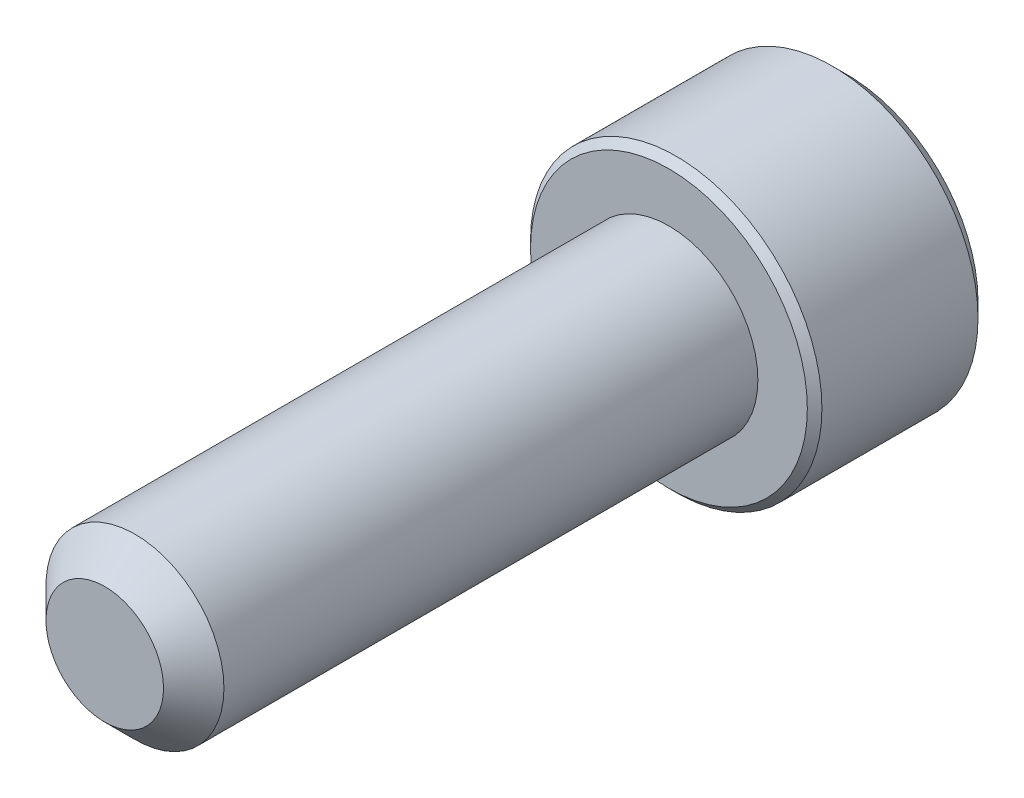
ISO-10303-21;
HEADER;
FILE_DESCRIPTION(('STEP AP214'),'2;1');
FILE_NAME('part.step','',(''),(''),'','','');
FILE_SCHEMA(('AUTOMOTIVE_DESIGN { 1 0 10303 214 1 1 1 1 }'));
ENDSEC;
DATA;
#1=APPLICATION_CONTEXT('core data for automotive mechanical design processes');
#2=APPLICATION_PROTOCOL_DEFINITION('international standard','automotive_design',2000,#1);
#3=PRODUCT_CONTEXT('',#1,'mechanical');
#4=PRODUCT('Part','Part','',(#3));
#5=PRODUCT_RELATED_PRODUCT_CATEGORY('part','',(#4));
#6=PRODUCT_DEFINITION_FORMATION('','',#4);
#7=PRODUCT_DEFINITION_CONTEXT('part definition',#1,'design');
#8=PRODUCT_DEFINITION('design','',#6,#7);
#9=PRODUCT_DEFINITION_SHAPE('','',#8);
#10=(LENGTH_UNIT() NAMED_UNIT(*) SI_UNIT(.MILLI.,.METRE.));
#11=(NAMED_UNIT(*) PLANE_ANGLE_UNIT() SI_UNIT($,.RADIAN.));
#12=(NAMED_UNIT(*) SI_UNIT($,.STERADIAN.) SOLID_ANGLE_UNIT());
#13=UNCERTAINTY_MEASURE_WITH_UNIT(LENGTH_MEASURE(1.E-05),#10,'distance_accuracy_value','');
#14=(GEOMETRIC_REPRESENTATION_CONTEXT(3) GLOBAL_UNCERTAINTY_ASSIGNED_CONTEXT((#13)) GLOBAL_UNIT_ASSIGNED_CONTEXT((#10,
#11,#12)) REPRESENTATION_CONTEXT('',''));
#15=CARTESIAN_POINT('',(0.,0.,0.));
#16=DIRECTION('',(0.,0.,1.));
#17=DIRECTION('',(1.,0.,0.));
#18=AXIS2_PLACEMENT_3D('',#15,#16,#17);
#19=CARTESIAN_POINT('',(0.,0.,-11.1125));
#20=DIRECTION('',(0.,0.,1.));
#21=DIRECTION('',(1.,0.,0.));
#22=AXIS2_PLACEMENT_3D('',#19,#20,#21);
#23=CYLINDRICAL_SURFACE('',#22,1.7526);
#24=CARTESIAN_POINT('',(0.,0.,-0.595312500000002));
#25=DIRECTION('',(0.,0.,1.));
#26=DIRECTION('',(1.,0.,0.));
#27=AXIS2_PLACEMENT_3D('',#24,#25,#26);
#28=CIRCLE('',#27,1.7526);
#29=CARTESIAN_POINT('',(1.7526,0.,-0.595312500000002));
#30=VERTEX_POINT('',#29);
#31=EDGE_CURVE('E123',#30,#30,#28,.F.);
#32=ORIENTED_EDGE('',*,*,#31,.T.);
#33=EDGE_LOOP('',(#32));
#34=FACE_BOUND('',#33,.T.);
#35=CARTESIAN_POINT('',(0.,0.,-11.1125));
#36=DIRECTION('',(0.,0.,-1.));
#37=DIRECTION('',(-1.,0.,0.));
#38=AXIS2_PLACEMENT_3D('',#35,#36,#37);
#39=CIRCLE('',#38,1.7526);
#40=CARTESIAN_POINT('',(-1.7526,0.,-11.1125));
#41=VERTEX_POINT('',#40);
#42=EDGE_CURVE('E226',#41,#41,#39,.F.);
#43=ORIENTED_EDGE('',*,*,#42,.T.);
#44=EDGE_LOOP('',(#43));
#45=FACE_BOUND('',#44,.T.);
#46=ADVANCED_FACE('F49',(#34,#45),#23,.T.);
#47=CARTESIAN_POINT('',(0.,0.,0.));
#48=DIRECTION('',(0.,0.,1.));
#49=DIRECTION('',(1.,0.,0.));
#50=AXIS2_PLACEMENT_3D('',#47,#48,#49);
#51=PLANE('',#50);
#52=CARTESIAN_POINT('',(0.,0.,0.));
#53=DIRECTION('',(0.,0.,1.));
#54=DIRECTION('',(1.,0.,0.));
#55=AXIS2_PLACEMENT_3D('',#52,#53,#54);
#56=CIRCLE('',#55,1.1572875);
#57=CARTESIAN_POINT('',(1.1572875,0.,0.));
#58=VERTEX_POINT('',#57);
#59=EDGE_CURVE('E225',#58,#58,#56,.T.);
#60=ORIENTED_EDGE('',*,*,#59,.T.);
#61=EDGE_LOOP('',(#60));
#62=FACE_BOUND('',#61,.T.);
#63=ADVANCED_FACE('F203',(#62),#51,.T.);
#64=CARTESIAN_POINT('',(0.,0.,0.));
#65=DIRECTION('',(0.,0.,-1.));
#66=DIRECTION('',(-1.,0.,0.));
#67=AXIS2_PLACEMENT_3D('',#64,#65,#66);
#68=CONICAL_SURFACE('',#67,1.1572875,0.785398163397447);
#69=ORIENTED_EDGE('',*,*,#31,.F.);
#70=EDGE_LOOP('',(#69));
#71=FACE_BOUND('',#70,.T.);
#72=ORIENTED_EDGE('',*,*,#59,.F.);
#73=EDGE_LOOP('',(#72));
#74=FACE_BOUND('',#73,.T.);
#75=ADVANCED_FACE('F209',(#71,#74),#68,.T.);
#76=CARTESIAN_POINT('',(0.,0.,-14.6177));
#77=DIRECTION('',(0.,0.,1.));
#78=DIRECTION('',(1.,0.,0.));
#79=AXIS2_PLACEMENT_3D('',#76,#77,#78);
#80=CYLINDRICAL_SURFACE('',#79,2.8702);
#81=CARTESIAN_POINT('',(0.,0.,-11.25601));
#82=DIRECTION('',(0.,0.,-1.));
#83=DIRECTION('',(-1.,0.,0.));
#84=AXIS2_PLACEMENT_3D('',#81,#82,#83);
#85=CIRCLE('',#84,2.8702);
#86=CARTESIAN_POINT('',(-2.8702,0.,-11.25601));
#87=VERTEX_POINT('',#86);
#88=EDGE_CURVE('E57',#87,#87,#85,.T.);
#89=ORIENTED_EDGE('',*,*,#88,.T.);
#90=EDGE_LOOP('',(#89));
#91=FACE_BOUND('',#90,.T.);
#92=CARTESIAN_POINT('',(0.,0.,-14.33068));
#93=DIRECTION('',(0.,0.,-1.));
#94=DIRECTION('',(-1.,0.,0.));
#95=AXIS2_PLACEMENT_3D('',#92,#93,#94);
#96=CIRCLE('',#95,2.8702);
#97=CARTESIAN_POINT('',(-2.8702,0.,-14.33068));
#98=VERTEX_POINT('',#97);
#99=EDGE_CURVE('E186',#98,#98,#96,.F.);
#100=ORIENTED_EDGE('',*,*,#99,.T.);
#101=EDGE_LOOP('',(#100));
#102=FACE_BOUND('',#101,.T.);
#103=ADVANCED_FACE('F191',(#91,#102),#80,.T.);
#104=CARTESIAN_POINT('',(0.,0.,-14.6177));
#105=DIRECTION('',(0.,0.,-1.));
#106=DIRECTION('',(-1.,0.,0.));
#107=AXIS2_PLACEMENT_3D('',#104,#105,#106);
#108=PLANE('',#107);
#109=CARTESIAN_POINT('',(0.,0.,-14.6177));
#110=DIRECTION('',(0.,0.,-1.));
#111=DIRECTION('',(-1.,0.,0.));
#112=AXIS2_PLACEMENT_3D('',#109,#110,#111);
#113=CIRCLE('',#112,2.58318);
#114=CARTESIAN_POINT('',(-2.58318,0.,-14.6177));
#115=VERTEX_POINT('',#114);
#116=EDGE_CURVE('E122',#115,#115,#113,.T.);
#117=ORIENTED_EDGE('',*,*,#116,.T.);
#118=EDGE_LOOP('',(#117));
#119=FACE_BOUND('',#118,.T.);
#120=CARTESIAN_POINT('',(0.,0.,-14.6177));
#121=DIRECTION('',(0.,0.,-1.));
#122=DIRECTION('',(-1.,0.,0.));
#123=AXIS2_PLACEMENT_3D('',#120,#121,#122);
#124=CIRCLE('',#123,1.60395121659243);
#125=CARTESIAN_POINT('',(-1.3890625,0.801975608296215,-14.6177));
#126=VERTEX_POINT('',#125);
#127=CARTESIAN_POINT('',(0.,1.60395121659243,-14.6177));
#128=VERTEX_POINT('',#127);
#129=EDGE_CURVE('E103',#126,#128,#124,.T.);
#130=ORIENTED_EDGE('',*,*,#129,.F.);
#131=CARTESIAN_POINT('',(-1.3890625,-0.801975608296215,-14.6177));
#132=VERTEX_POINT('',#131);
#133=EDGE_CURVE('E63',#132,#126,#124,.T.);
#134=ORIENTED_EDGE('',*,*,#133,.F.);
#135=CARTESIAN_POINT('',(0.,-1.60395121659243,-14.6177));
#136=VERTEX_POINT('',#135);
#137=EDGE_CURVE('E285',#136,#132,#124,.T.);
#138=ORIENTED_EDGE('',*,*,#137,.F.);
#139=CARTESIAN_POINT('',(1.3890625,-0.801975608296214,-14.6177));
#140=VERTEX_POINT('',#139);
#141=EDGE_CURVE('E70',#140,#136,#124,.T.);
#142=ORIENTED_EDGE('',*,*,#141,.F.);
#143=CARTESIAN_POINT('',(1.3890625,0.801975608296215,-14.6177));
#144=VERTEX_POINT('',#143);
#145=EDGE_CURVE('E144',#144,#140,#124,.T.);
#146=ORIENTED_EDGE('',*,*,#145,.F.);
#147=EDGE_CURVE('E112',#128,#144,#124,.T.);
#148=ORIENTED_EDGE('',*,*,#147,.F.);
#149=EDGE_LOOP('',(#130,#134,#138,#142,#146,#148));
#150=FACE_BOUND('',#149,.T.);
#151=ADVANCED_FACE('F143',(#119,#150),#108,.T.);
#152=CARTESIAN_POINT('',(0.,0.,-11.1125));
#153=DIRECTION('',(0.,0.,-1.));
#154=DIRECTION('',(-1.,0.,0.));
#155=AXIS2_PLACEMENT_3D('',#152,#153,#154);
#156=PLANE('',#155);
#157=CARTESIAN_POINT('',(0.,0.,-11.1125));
#158=DIRECTION('',(0.,0.,-1.));
#159=DIRECTION('',(-1.,0.,0.));
#160=AXIS2_PLACEMENT_3D('',#157,#158,#159);
#161=CIRCLE('',#160,2.72669);
#162=CARTESIAN_POINT('',(-2.72669,0.,-11.1125));
#163=VERTEX_POINT('',#162);
#164=EDGE_CURVE('E14',#163,#163,#161,.F.);
#165=ORIENTED_EDGE('',*,*,#164,.T.);
#166=EDGE_LOOP('',(#165));
#167=FACE_BOUND('',#166,.T.);
#168=ORIENTED_EDGE('',*,*,#42,.F.);
#169=EDGE_LOOP('',(#168));
#170=FACE_BOUND('',#169,.T.);
#171=ADVANCED_FACE('F297',(#167,#170),#156,.F.);
#172=CARTESIAN_POINT('',(0.,0.,-14.6177));
#173=DIRECTION('',(0.,0.,-1.));
#174=DIRECTION('',(-1.,0.,0.));
#175=AXIS2_PLACEMENT_3D('',#172,#173,#174);
#176=CONICAL_SURFACE('',#175,1.60395121659243,0.78539816339745);
#177=ORIENTED_EDGE('',*,*,#147,.T.);
#178=CARTESIAN_POINT('',(-0.000199999999999834,1.60406668664627,-14.6178154825221));
#179=CARTESIAN_POINT('',(0.047554814899586,1.57649543140889,-14.5902647868811));
#180=CARTESIAN_POINT('',(0.0961082129767679,1.54846311395896,-14.5643319141145));
#181=CARTESIAN_POINT('',(0.195114281423185,1.49130193369001,-14.5168489608708));
#182=CARTESIAN_POINT('',(0.245576372730142,1.46216763169007,-14.4953253080794));
#183=CARTESIAN_POINT('',(0.34733083528491,1.40341966534283,-14.4584546019866));
#184=CARTESIAN_POINT('',(0.398597278416376,1.37382097060048,-14.4430148513149));
#185=CARTESIAN_POINT('',(0.502259069123939,1.31397180783079,-14.4192264581829));
#186=CARTESIAN_POINT('',(0.554651247789434,1.28372316937484,-14.4108600517165));
#187=CARTESIAN_POINT('',(0.644944084544837,1.23159257576821,-14.4033113663708));
#188=CARTESIAN_POINT('',(0.682728034255603,1.20977800223165,-14.4021936971037));
#189=CARTESIAN_POINT('',(0.758229287800439,1.16618733317339,-14.4040750513552));
#190=CARTESIAN_POINT('',(0.79594657508652,1.14441124720567,-14.4070749834252));
#191=CARTESIAN_POINT('',(0.871018018906522,1.10106872890773,-14.4170189567457));
#192=CARTESIAN_POINT('',(0.908371804329555,1.07950251083849,-14.4239666704902));
#193=CARTESIAN_POINT('',(0.982452435596042,1.03673203843505,-14.4414288810594));
#194=CARTESIAN_POINT('',(1.01917900521513,1.01552794357906,-14.4519449088769));
#195=CARTESIAN_POINT('',(1.11325413716704,0.961213640822576,-14.4831664203823));
#196=CARTESIAN_POINT('',(1.17001916310317,0.928440337817793,-14.5062263608604));
#197=CARTESIAN_POINT('',(1.25348479270274,0.880251434100401,-14.5451547118295));
#198=CARTESIAN_POINT('',(1.28098915116073,0.864371785340789,-14.5588318145832));
#199=CARTESIAN_POINT('',(1.33549195495674,0.832904576897576,-14.5874348081189));
#200=CARTESIAN_POINT('',(1.36249063449213,0.817316882000055,-14.6023601023926));
#201=CARTESIAN_POINT('',(1.3892625,0.801860138242377,-14.6178154825221));
#202=B_SPLINE_CURVE_WITH_KNOTS('',3,(#178,#179,#180,#181,#182,#183,#184,#185,#186,#187,#188,
#189,#190,#191,#192,#193,#194,#195,#196,#197,#198,#199,#200,#201),.UNSPECIFIED.,.F.,.F.,(4,2,2,
2,2,2,2,2,2,2,2,4),(0.,0.185054161583332,0.371186974731966,0.554362620151554,0.737076859824674,
0.867821902366108,0.998595798526819,1.12949154907136,1.26044353188444,1.46846066168042,
1.57218026599104,1.67585058309997),.UNSPECIFIED.);
#203=EDGE_CURVE('E117',#128,#144,#202,.T.);
#204=ORIENTED_EDGE('',*,*,#203,.F.);
#205=EDGE_LOOP('',(#177,#204));
#206=FACE_BOUND('',#205,.T.);
#207=ADVANCED_FACE('F118',(#206),#176,.F.);
#208=ORIENTED_EDGE('',*,*,#145,.T.);
#209=CARTESIAN_POINT('',(1.3890625,-1.59946669533747,-15.1321888553473));
#210=CARTESIAN_POINT('',(1.3890625,-1.56052074100157,-15.1027883204447));
#211=CARTESIAN_POINT('',(1.3890625,-1.52135778101398,-15.0736760571059));
#212=CARTESIAN_POINT('',(1.3890625,-1.44250974368035,-15.0161471018554));
#213=CARTESIAN_POINT('',(1.3890625,-1.40282453775616,-14.9877305863579));
#214=CARTESIAN_POINT('',(1.3890625,-1.28227261747607,-14.9032979106091));
#215=CARTESIAN_POINT('',(1.3890625,-1.20050167441145,-14.8485513931364));
#216=CARTESIAN_POINT('',(1.3890625,-1.0290311937974,-14.7410774539605));
#217=CARTESIAN_POINT('',(1.3890625,-0.939145510476104,-14.6886436435155));
#218=CARTESIAN_POINT('',(1.3890625,-0.754884542278013,-14.5927310286316));
#219=CARTESIAN_POINT('',(1.3890625,-0.660525767721076,-14.5492220353823));
#220=CARTESIAN_POINT('',(1.3890625,-0.518892422901336,-14.4959928148428));
#221=CARTESIAN_POINT('',(1.3890625,-0.473714746794419,-14.4807156455446));
#222=CARTESIAN_POINT('',(1.3890625,-0.382268722235191,-14.4537883218985));
#223=CARTESIAN_POINT('',(1.3890625,-0.336000298881662,-14.4421384174186));
#224=CARTESIAN_POINT('',(1.3890625,-0.243422308835822,-14.4232647672582));
#225=CARTESIAN_POINT('',(1.3890625,-0.197128447486238,-14.4159651868372));
#226=CARTESIAN_POINT('',(1.3890625,-0.104045636784198,-14.405934703163));
#227=CARTESIAN_POINT('',(1.3890625,-0.057256773928493,-14.4032030145629));
#228=CARTESIAN_POINT('',(1.3890625,0.0346588401718091,-14.4025109514094));
#229=CARTESIAN_POINT('',(1.3890625,0.0797843745088176,-14.4043812460884));
#230=CARTESIAN_POINT('',(1.3890625,0.169653022605208,-14.4124168656859));
#231=CARTESIAN_POINT('',(1.3890625,0.214396061393213,-14.4185830139257));
#232=CARTESIAN_POINT('',(1.3890625,0.303926740576741,-14.4349783142406));
#233=CARTESIAN_POINT('',(1.3890625,0.348701560562637,-14.4452764230037));
#234=CARTESIAN_POINT('',(1.3890625,0.437272889801829,-14.4693883282635));
#235=CARTESIAN_POINT('',(1.3890625,0.481069480580726,-14.4832018305893));
#236=CARTESIAN_POINT('',(1.3890625,0.618958177531064,-14.5318885558667));
#237=CARTESIAN_POINT('',(1.3890625,0.711087679809601,-14.5723066296314));
#238=CARTESIAN_POINT('',(1.3890625,0.891018647016392,-14.6621712938188));
#239=CARTESIAN_POINT('',(1.3890625,0.978803075143675,-14.7116503209353));
#240=CARTESIAN_POINT('',(1.3890625,1.14657176186196,-14.8137299189673));
#241=CARTESIAN_POINT('',(1.3890625,1.22672686003424,-14.8660531888122));
#242=CARTESIAN_POINT('',(1.3890625,1.34481925924245,-14.9469395512885));
#243=CARTESIAN_POINT('',(1.3890625,1.38367371461019,-14.9741868720938));
#244=CARTESIAN_POINT('',(1.3890625,1.46085170378017,-15.0294021635328));
#245=CARTESIAN_POINT('',(1.3890625,1.49917537967343,-15.0573699353332));
#246=CARTESIAN_POINT('',(1.3890625,1.53727804285926,-15.0856364275532));
#247=B_SPLINE_CURVE_WITH_KNOTS('',3,(#209,#210,#211,#212,#213,#214,#215,#216,#217,#218,#219,
#220,#221,#222,#223,#224,#225,#226,#227,#228,#229,#230,#231,#232,#233,#234,#235,#236,#237,#238,
#239,#240,#241,#242,#243,#244,#245,#246),.UNSPECIFIED.,.F.,.F.,(4,2,2,2,2,2,2,2,2,2,2,2,2,2,2,2,
2,2,4),(0.,0.146388252251747,0.292813246205363,0.587897938676556,0.899825715593294,
1.21068031322194,1.35363178607714,1.49659310411811,1.6369833143961,1.77734938523477,
1.91262840625218,2.04793336128669,2.18559709790565,2.32324931849741,2.62418012481466,
2.92621005486572,3.2132312503121,3.35559422447357,3.49791832091463),.UNSPECIFIED.);
#248=EDGE_CURVE('E111',#144,#140,#247,.F.);
#249=ORIENTED_EDGE('',*,*,#248,.F.);
#250=EDGE_LOOP('',(#208,#249));
#251=FACE_BOUND('',#250,.T.);
#252=ADVANCED_FACE('F291',(#251),#176,.F.);
#253=ORIENTED_EDGE('',*,*,#141,.T.);
#254=CARTESIAN_POINT('',(1.3892625,-0.801860138242377,-14.6178154825221));
#255=CARTESIAN_POINT('',(1.34150768510041,-0.829431393479753,-14.5902647868811));
#256=CARTESIAN_POINT('',(1.29295428702323,-0.857463710929685,-14.5643319141145));
#257=CARTESIAN_POINT('',(1.19394821857682,-0.914624891198631,-14.5168489608708));
#258=CARTESIAN_POINT('',(1.14348612726986,-0.943759193198573,-14.4953253080794));
#259=CARTESIAN_POINT('',(1.04173166471509,-1.00250715954581,-14.4584546019866));
#260=CARTESIAN_POINT('',(0.990465221583624,-1.03210585428816,-14.4430148513149));
#261=CARTESIAN_POINT('',(0.886803430876061,-1.09195501705785,-14.4192264581829));
#262=CARTESIAN_POINT('',(0.834411252210567,-1.12220365551381,-14.4108600517165));
#263=CARTESIAN_POINT('',(0.744118415455164,-1.17433424912043,-14.4033113663708));
#264=CARTESIAN_POINT('',(0.706334465744398,-1.19614882265699,-14.4021936971037));
#265=CARTESIAN_POINT('',(0.630833212199561,-1.23973949171526,-14.4040750513552));
#266=CARTESIAN_POINT('',(0.593115924913481,-1.26151557768298,-14.4070749834252));
#267=CARTESIAN_POINT('',(0.518044481093479,-1.30485809598091,-14.4170189567457));
#268=CARTESIAN_POINT('',(0.480690695670446,-1.32642431405015,-14.4239666704902));
#269=CARTESIAN_POINT('',(0.406610064403959,-1.36919478645359,-14.4414288810594));
#270=CARTESIAN_POINT('',(0.369883494784871,-1.39039888130958,-14.4519449088769));
#271=CARTESIAN_POINT('',(0.275808362832965,-1.44471318406607,-14.4831664203823));
#272=CARTESIAN_POINT('',(0.219043336896831,-1.47748648707085,-14.5062263608604));
#273=CARTESIAN_POINT('',(0.135577707297263,-1.52567539078824,-14.5451547118294));
#274=CARTESIAN_POINT('',(0.108073348839267,-1.54155503954785,-14.5588318145832));
#275=CARTESIAN_POINT('',(0.0535705450432608,-1.57302224799107,-14.5874348081189));
#276=CARTESIAN_POINT('',(0.0265718655078728,-1.58860994288859,-14.6023601023926));
#277=CARTESIAN_POINT('',(-0.000199999999999489,-1.60406668664627,-14.6178154825221));
#278=B_SPLINE_CURVE_WITH_KNOTS('',3,(#254,#255,#256,#257,#258,#259,#260,#261,#262,#263,#264,
#265,#266,#267,#268,#269,#270,#271,#272,#273,#274,#275,#276,#277),.UNSPECIFIED.,.F.,.F.,(4,2,2,
2,2,2,2,2,2,2,2,4),(0.,0.185054161583332,0.371186974731966,0.554362620151553,0.737076859824674,
0.867821902366108,0.998595798526818,1.12949154907136,1.26044353188444,1.46846066168042,
1.57218026599104,1.67585058309997),.UNSPECIFIED.);
#279=EDGE_CURVE('E154',#140,#136,#278,.T.);
#280=ORIENTED_EDGE('',*,*,#279,.F.);
#281=EDGE_LOOP('',(#253,#280));
#282=FACE_BOUND('',#281,.T.);
#283=ADVANCED_FACE('F288',(#282),#176,.F.);
#284=ORIENTED_EDGE('',*,*,#137,.T.);
#285=CARTESIAN_POINT('',(0.000200000000000174,-1.60406668664627,-14.6178154825221));
#286=CARTESIAN_POINT('',(-0.0475548148995862,-1.57649543140889,-14.5902647868811));
#287=CARTESIAN_POINT('',(-0.0961082129767681,-1.54846311395896,-14.5643319141145));
#288=CARTESIAN_POINT('',(-0.195114281423185,-1.49130193369001,-14.5168489608708));
#289=CARTESIAN_POINT('',(-0.245576372730141,-1.46216763169007,-14.4953253080794));
#290=CARTESIAN_POINT('',(-0.34733083528491,-1.40341966534283,-14.4584546019866));
#291=CARTESIAN_POINT('',(-0.398597278416376,-1.37382097060048,-14.4430148513149));
#292=CARTESIAN_POINT('',(-0.502259069123939,-1.31397180783079,-14.4192264581829));
#293=CARTESIAN_POINT('',(-0.554651247789433,-1.28372316937484,-14.4108600517165));
#294=CARTESIAN_POINT('',(-0.644944084544836,-1.23159257576821,-14.4033113663708));
#295=CARTESIAN_POINT('',(-0.682728034255602,-1.20977800223165,-14.4021936971037));
#296=CARTESIAN_POINT('',(-0.758229287800439,-1.16618733317339,-14.4040750513552));
#297=CARTESIAN_POINT('',(-0.795946575086519,-1.14441124720567,-14.4070749834252));
#298=CARTESIAN_POINT('',(-0.871018018906522,-1.10106872890773,-14.4170189567457));
#299=CARTESIAN_POINT('',(-0.908371804329555,-1.07950251083849,-14.4239666704902));
#300=CARTESIAN_POINT('',(-0.982452435596041,-1.03673203843505,-14.4414288810594));
#301=CARTESIAN_POINT('',(-1.01917900521513,-1.01552794357906,-14.4519449088769));
#302=CARTESIAN_POINT('',(-1.11325413716704,-0.961213640822577,-14.4831664203823));
#303=CARTESIAN_POINT('',(-1.17001916310317,-0.928440337817793,-14.5062263608604));
#304=CARTESIAN_POINT('',(-1.25348479270274,-0.880251434100401,-14.5451547118295));
#305=CARTESIAN_POINT('',(-1.28098915116073,-0.864371785340789,-14.5588318145832));
#306=CARTESIAN_POINT('',(-1.33549195495674,-0.832904576897576,-14.5874348081189));
#307=CARTESIAN_POINT('',(-1.36249063449213,-0.817316882000055,-14.6023601023926));
#308=CARTESIAN_POINT('',(-1.3892625,-0.801860138242377,-14.6178154825221));
#309=B_SPLINE_CURVE_WITH_KNOTS('',3,(#285,#286,#287,#288,#289,#290,#291,#292,#293,#294,#295,
#296,#297,#298,#299,#300,#301,#302,#303,#304,#305,#306,#307,#308),.UNSPECIFIED.,.F.,.F.,(4,2,2,
2,2,2,2,2,2,2,2,4),(0.,0.185054161583333,0.371186974731967,0.554362620151554,0.737076859824674,
0.867821902366108,0.998595798526819,1.12949154907136,1.26044353188444,1.46846066168042,
1.57218026599104,1.67585058309997),.UNSPECIFIED.);
#310=EDGE_CURVE('E262',#136,#132,#309,.T.);
#311=ORIENTED_EDGE('',*,*,#310,.F.);
#312=EDGE_LOOP('',(#284,#311));
#313=FACE_BOUND('',#312,.T.);
#314=ADVANCED_FACE('F287',(#313),#176,.F.);
#315=ORIENTED_EDGE('',*,*,#133,.T.);
#316=CARTESIAN_POINT('',(-1.3890625,-1.59946669533747,-15.1321888553473));
#317=CARTESIAN_POINT('',(-1.3890625,-1.56052074100157,-15.1027883204447));
#318=CARTESIAN_POINT('',(-1.3890625,-1.52135778101398,-15.0736760571059));
#319=CARTESIAN_POINT('',(-1.3890625,-1.44250974368035,-15.0161471018554));
#320=CARTESIAN_POINT('',(-1.3890625,-1.40282453775616,-14.9877305863579));
#321=CARTESIAN_POINT('',(-1.3890625,-1.28227261747607,-14.9032979106091));
#322=CARTESIAN_POINT('',(-1.3890625,-1.20050167441145,-14.8485513931364));
#323=CARTESIAN_POINT('',(-1.3890625,-1.0290311937974,-14.7410774539605));
#324=CARTESIAN_POINT('',(-1.3890625,-0.939145510476106,-14.6886436435155));
#325=CARTESIAN_POINT('',(-1.3890625,-0.754884542278015,-14.5927310286316));
#326=CARTESIAN_POINT('',(-1.3890625,-0.660525767721078,-14.5492220353823));
#327=CARTESIAN_POINT('',(-1.3890625,-0.518892422901337,-14.4959928148428));
#328=CARTESIAN_POINT('',(-1.3890625,-0.473714746794421,-14.4807156455446));
#329=CARTESIAN_POINT('',(-1.3890625,-0.382268722235192,-14.4537883218985));
#330=CARTESIAN_POINT('',(-1.3890625,-0.336000298881664,-14.4421384174186));
#331=CARTESIAN_POINT('',(-1.3890625,-0.243422308835824,-14.4232647672582));
#332=CARTESIAN_POINT('',(-1.3890625,-0.197128447486239,-14.4159651868372));
#333=CARTESIAN_POINT('',(-1.3890625,-0.104045636784198,-14.405934703163));
#334=CARTESIAN_POINT('',(-1.3890625,-0.0572567739284929,-14.4032030145629));
#335=CARTESIAN_POINT('',(-1.3890625,0.0346588401718094,-14.4025109514094));
#336=CARTESIAN_POINT('',(-1.3890625,0.0797843745088178,-14.4043812460884));
#337=CARTESIAN_POINT('',(-1.3890625,0.169653022605209,-14.4124168656859));
#338=CARTESIAN_POINT('',(-1.3890625,0.214396061393213,-14.4185830139257));
#339=CARTESIAN_POINT('',(-1.3890625,0.303926740576741,-14.4349783142406));
#340=CARTESIAN_POINT('',(-1.3890625,0.348701560562638,-14.4452764230037));
#341=CARTESIAN_POINT('',(-1.3890625,0.437272889801829,-14.4693883282635));
#342=CARTESIAN_POINT('',(-1.3890625,0.481069480580726,-14.4832018305893));
#343=CARTESIAN_POINT('',(-1.3890625,0.618958177531064,-14.5318885558667));
#344=CARTESIAN_POINT('',(-1.3890625,0.711087679809601,-14.5723066296314));
#345=CARTESIAN_POINT('',(-1.3890625,0.891018647016393,-14.6621712938188));
#346=CARTESIAN_POINT('',(-1.3890625,0.978803075143676,-14.7116503209353));
#347=CARTESIAN_POINT('',(-1.3890625,1.14657176186197,-14.8137299189673));
#348=CARTESIAN_POINT('',(-1.3890625,1.22672686003424,-14.8660531888122));
#349=CARTESIAN_POINT('',(-1.3890625,1.34481925924245,-14.9469395512885));
#350=CARTESIAN_POINT('',(-1.3890625,1.3836737146102,-14.9741868720938));
#351=CARTESIAN_POINT('',(-1.3890625,1.46085170378018,-15.0294021635328));
#352=CARTESIAN_POINT('',(-1.3890625,1.49917537967343,-15.0573699353332));
#353=CARTESIAN_POINT('',(-1.3890625,1.53727804285926,-15.0856364275532));
#354=B_SPLINE_CURVE_WITH_KNOTS('',3,(#316,#317,#318,#319,#320,#321,#322,#323,#324,#325,#326,
#327,#328,#329,#330,#331,#332,#333,#334,#335,#336,#337,#338,#339,#340,#341,#342,#343,#344,#345,
#346,#347,#348,#349,#350,#351,#352,#353),.UNSPECIFIED.,.F.,.F.,(4,2,2,2,2,2,2,2,2,2,2,2,2,2,2,2,
2,2,4),(0.,0.146388252251748,0.292813246205363,0.587897938676555,0.899825715593293,
1.21068031322194,1.35363178607714,1.49659310411811,1.6369833143961,1.77734938523478,
1.91262840625218,2.04793336128669,2.18559709790565,2.32324931849741,2.62418012481466,
2.92621005486573,3.2132312503121,3.35559422447358,3.49791832091463),.UNSPECIFIED.);
#355=EDGE_CURVE('E133',#132,#126,#354,.T.);
#356=ORIENTED_EDGE('',*,*,#355,.F.);
#357=EDGE_LOOP('',(#315,#356));
#358=FACE_BOUND('',#357,.T.);
#359=ADVANCED_FACE('F304',(#358),#176,.F.);
#360=ORIENTED_EDGE('',*,*,#129,.T.);
#361=CARTESIAN_POINT('',(-1.3892625,0.801860138242377,-14.6178154825221));
#362=CARTESIAN_POINT('',(-1.34150768510041,0.829431393479754,-14.5902647868811));
#363=CARTESIAN_POINT('',(-1.29295428702323,0.857463710929686,-14.5643319141145));
#364=CARTESIAN_POINT('',(-1.19394821857681,0.914624891198631,-14.5168489608708));
#365=CARTESIAN_POINT('',(-1.14348612726986,0.943759193198574,-14.4953253080794));
#366=CARTESIAN_POINT('',(-1.04173166471509,1.00250715954582,-14.4584546019866));
#367=CARTESIAN_POINT('',(-0.990465221583623,1.03210585428816,-14.4430148513149));
#368=CARTESIAN_POINT('',(-0.886803430876061,1.09195501705785,-14.4192264581829));
#369=CARTESIAN_POINT('',(-0.834411252210566,1.12220365551381,-14.4108600517165));
#370=CARTESIAN_POINT('',(-0.744118415455164,1.17433424912043,-14.4033113663708));
#371=CARTESIAN_POINT('',(-0.706334465744397,1.19614882265699,-14.4021936971037));
#372=CARTESIAN_POINT('',(-0.630833212199561,1.23973949171526,-14.4040750513552));
#373=CARTESIAN_POINT('',(-0.59311592491348,1.26151557768298,-14.4070749834252));
#374=CARTESIAN_POINT('',(-0.518044481093478,1.30485809598091,-14.4170189567457));
#375=CARTESIAN_POINT('',(-0.480690695670445,1.32642431405015,-14.4239666704902));
#376=CARTESIAN_POINT('',(-0.406610064403958,1.36919478645359,-14.4414288810594));
#377=CARTESIAN_POINT('',(-0.36988349478487,1.39039888130958,-14.4519449088769));
#378=CARTESIAN_POINT('',(-0.275808362832964,1.44471318406607,-14.4831664203823));
#379=CARTESIAN_POINT('',(-0.21904333689683,1.47748648707085,-14.5062263608604));
#380=CARTESIAN_POINT('',(-0.135577707297262,1.52567539078824,-14.5451547118295));
#381=CARTESIAN_POINT('',(-0.108073348839266,1.54155503954785,-14.5588318145832));
#382=CARTESIAN_POINT('',(-0.0535705450432598,1.57302224799107,-14.5874348081189));
#383=CARTESIAN_POINT('',(-0.026571865507872,1.58860994288859,-14.6023601023926));
#384=CARTESIAN_POINT('',(0.000199999999999812,1.60406668664627,-14.6178154825221));
#385=B_SPLINE_CURVE_WITH_KNOTS('',3,(#361,#362,#363,#364,#365,#366,#367,#368,#369,#370,#371,
#372,#373,#374,#375,#376,#377,#378,#379,#380,#381,#382,#383,#384),.UNSPECIFIED.,.F.,.F.,(4,2,2,
2,2,2,2,2,2,2,2,4),(0.,0.185054161583332,0.371186974731966,0.554362620151554,0.737076859824674,
0.867821902366108,0.998595798526818,1.12949154907136,1.26044353188444,1.46846066168042,
1.57218026599104,1.67585058309997),.UNSPECIFIED.);
#386=EDGE_CURVE('E107',#126,#128,#385,.T.);
#387=ORIENTED_EDGE('',*,*,#386,.F.);
#388=EDGE_LOOP('',(#360,#387));
#389=FACE_BOUND('',#388,.T.);
#390=ADVANCED_FACE('F105',(#389),#176,.F.);
#391=CARTESIAN_POINT('',(1.3890625,2.40592682488864,-12.53410625));
#392=DIRECTION('',(0.,0.,-1.));
#393=DIRECTION('',(-1.,0.,0.));
#394=AXIS2_PLACEMENT_3D('',#391,#392,#393);
#395=PLANE('',#394);
#396=DIRECTION('',(0.866025403784439,0.5,0.));
#397=VECTOR('',#396,1.);
#398=CARTESIAN_POINT('',(-1.3890625,0.801975608296215,-12.53410625));
#399=LINE('',#398,#397);
#400=CARTESIAN_POINT('',(-1.3890625,0.801975608296215,-12.53410625));
#401=VERTEX_POINT('',#400);
#402=CARTESIAN_POINT('',(0.,1.60395121659243,-12.53410625));
#403=VERTEX_POINT('',#402);
#404=EDGE_CURVE('E132',#401,#403,#399,.T.);
#405=ORIENTED_EDGE('',*,*,#404,.T.);
#406=DIRECTION('',(0.866025403784439,-0.5,0.));
#407=VECTOR('',#406,1.);
#408=CARTESIAN_POINT('',(0.,1.60395121659243,-12.53410625));
#409=LINE('',#408,#407);
#410=CARTESIAN_POINT('',(1.3890625,0.801975608296215,-12.53410625));
#411=VERTEX_POINT('',#410);
#412=EDGE_CURVE('E137',#403,#411,#409,.T.);
#413=ORIENTED_EDGE('',*,*,#412,.T.);
#414=DIRECTION('',(0.,-1.,0.));
#415=VECTOR('',#414,1.);
#416=CARTESIAN_POINT('',(1.3890625,0.801975608296215,-12.53410625));
#417=LINE('',#416,#415);
#418=CARTESIAN_POINT('',(1.3890625,-0.801975608296215,-12.53410625));
#419=VERTEX_POINT('',#418);
#420=EDGE_CURVE('E248',#411,#419,#417,.T.);
#421=ORIENTED_EDGE('',*,*,#420,.T.);
#422=DIRECTION('',(-0.866025403784439,-0.5,0.));
#423=VECTOR('',#422,1.);
#424=CARTESIAN_POINT('',(1.3890625,-0.801975608296215,-12.53410625));
#425=LINE('',#424,#423);
#426=CARTESIAN_POINT('',(0.,-1.60395121659243,-12.53410625));
#427=VERTEX_POINT('',#426);
#428=EDGE_CURVE('E245',#419,#427,#425,.T.);
#429=ORIENTED_EDGE('',*,*,#428,.T.);
#430=DIRECTION('',(-0.866025403784439,0.5,0.));
#431=VECTOR('',#430,1.);
#432=CARTESIAN_POINT('',(0.,-1.60395121659243,-12.53410625));
#433=LINE('',#432,#431);
#434=CARTESIAN_POINT('',(-1.3890625,-0.801975608296215,-12.53410625));
#435=VERTEX_POINT('',#434);
#436=EDGE_CURVE('E242',#427,#435,#433,.T.);
#437=ORIENTED_EDGE('',*,*,#436,.T.);
#438=DIRECTION('',(0.,1.,0.));
#439=VECTOR('',#438,1.);
#440=CARTESIAN_POINT('',(-1.3890625,-0.801975608296215,-12.53410625));
#441=LINE('',#440,#439);
#442=EDGE_CURVE('E140',#435,#401,#441,.T.);
#443=ORIENTED_EDGE('',*,*,#442,.T.);
#444=EDGE_LOOP('',(#405,#413,#421,#429,#437,#443));
#445=FACE_BOUND('',#444,.T.);
#446=ADVANCED_FACE('F174',(#445),#395,.T.);
#447=CARTESIAN_POINT('',(0.,1.60395121659243,-12.53410625));
#448=DIRECTION('',(0.5,0.866025403784439,0.));
#449=DIRECTION('',(-0.866025403784439,0.5,0.));
#450=AXIS2_PLACEMENT_3D('',#447,#448,#449);
#451=PLANE('',#450);
#452=DIRECTION('',(0.,0.,-1.));
#453=VECTOR('',#452,1.);
#454=CARTESIAN_POINT('',(0.,1.60395121659243,-12.53410625));
#455=LINE('',#454,#453);
#456=EDGE_CURVE('E129',#403,#128,#455,.T.);
#457=ORIENTED_EDGE('',*,*,#456,.T.);
#458=ORIENTED_EDGE('',*,*,#203,.T.);
#459=DIRECTION('',(0.,0.,-1.));
#460=VECTOR('',#459,1.);
#461=CARTESIAN_POINT('',(1.3890625,0.801975608296215,-12.53410625));
#462=LINE('',#461,#460);
#463=EDGE_CURVE('E139',#411,#144,#462,.T.);
#464=ORIENTED_EDGE('',*,*,#463,.F.);
#465=ORIENTED_EDGE('',*,*,#412,.F.);
#466=EDGE_LOOP('',(#457,#458,#464,#465));
#467=FACE_BOUND('',#466,.T.);
#468=ADVANCED_FACE('F135',(#467),#451,.F.);
#469=CARTESIAN_POINT('',(1.3890625,0.801975608296215,-12.53410625));
#470=DIRECTION('',(1.,0.,0.));
#471=DIRECTION('',(0.,1.,0.));
#472=AXIS2_PLACEMENT_3D('',#469,#470,#471);
#473=PLANE('',#472);
#474=ORIENTED_EDGE('',*,*,#463,.T.);
#475=ORIENTED_EDGE('',*,*,#248,.T.);
#476=DIRECTION('',(0.,0.,-1.));
#477=VECTOR('',#476,1.);
#478=CARTESIAN_POINT('',(1.3890625,-0.801975608296215,-12.53410625));
#479=LINE('',#478,#477);
#480=EDGE_CURVE('E231',#419,#140,#479,.T.);
#481=ORIENTED_EDGE('',*,*,#480,.F.);
#482=ORIENTED_EDGE('',*,*,#420,.F.);
#483=EDGE_LOOP('',(#474,#475,#481,#482));
#484=FACE_BOUND('',#483,.T.);
#485=ADVANCED_FACE('F163',(#484),#473,.F.);
#486=CARTESIAN_POINT('',(1.3890625,-0.801975608296215,-12.53410625));
#487=DIRECTION('',(0.5,-0.866025403784439,0.));
#488=DIRECTION('',(0.866025403784439,0.5,0.));
#489=AXIS2_PLACEMENT_3D('',#486,#487,#488);
#490=PLANE('',#489);
#491=ORIENTED_EDGE('',*,*,#480,.T.);
#492=ORIENTED_EDGE('',*,*,#279,.T.);
#493=DIRECTION('',(0.,0.,-1.));
#494=VECTOR('',#493,1.);
#495=CARTESIAN_POINT('',(0.,-1.60395121659243,-12.53410625));
#496=LINE('',#495,#494);
#497=EDGE_CURVE('E234',#427,#136,#496,.T.);
#498=ORIENTED_EDGE('',*,*,#497,.F.);
#499=ORIENTED_EDGE('',*,*,#428,.F.);
#500=EDGE_LOOP('',(#491,#492,#498,#499));
#501=FACE_BOUND('',#500,.T.);
#502=ADVANCED_FACE('F167',(#501),#490,.F.);
#503=CARTESIAN_POINT('',(0.,-1.60395121659243,-12.53410625));
#504=DIRECTION('',(-0.5,-0.866025403784439,0.));
#505=DIRECTION('',(0.866025403784439,-0.5,0.));
#506=AXIS2_PLACEMENT_3D('',#503,#504,#505);
#507=PLANE('',#506);
#508=ORIENTED_EDGE('',*,*,#497,.T.);
#509=ORIENTED_EDGE('',*,*,#310,.T.);
#510=DIRECTION('',(0.,0.,-1.));
#511=VECTOR('',#510,1.);
#512=CARTESIAN_POINT('',(-1.3890625,-0.801975608296215,-12.53410625));
#513=LINE('',#512,#511);
#514=EDGE_CURVE('E237',#435,#132,#513,.T.);
#515=ORIENTED_EDGE('',*,*,#514,.F.);
#516=ORIENTED_EDGE('',*,*,#436,.F.);
#517=EDGE_LOOP('',(#508,#509,#515,#516));
#518=FACE_BOUND('',#517,.T.);
#519=ADVANCED_FACE('F270',(#518),#507,.F.);
#520=CARTESIAN_POINT('',(-1.3890625,-0.801975608296215,-12.53410625));
#521=DIRECTION('',(-1.,0.,0.));
#522=DIRECTION('',(0.,-1.,0.));
#523=AXIS2_PLACEMENT_3D('',#520,#521,#522);
#524=PLANE('',#523);
#525=ORIENTED_EDGE('',*,*,#514,.T.);
#526=ORIENTED_EDGE('',*,*,#355,.T.);
#527=DIRECTION('',(0.,0.,-1.));
#528=VECTOR('',#527,1.);
#529=CARTESIAN_POINT('',(-1.3890625,0.801975608296215,-12.53410625));
#530=LINE('',#529,#528);
#531=EDGE_CURVE('E131',#401,#126,#530,.T.);
#532=ORIENTED_EDGE('',*,*,#531,.F.);
#533=ORIENTED_EDGE('',*,*,#442,.F.);
#534=EDGE_LOOP('',(#525,#526,#532,#533));
#535=FACE_BOUND('',#534,.T.);
#536=ADVANCED_FACE('F267',(#535),#524,.F.);
#537=CARTESIAN_POINT('',(-1.3890625,0.801975608296215,-12.53410625));
#538=DIRECTION('',(-0.5,0.866025403784439,0.));
#539=DIRECTION('',(-0.866025403784439,-0.5,0.));
#540=AXIS2_PLACEMENT_3D('',#537,#538,#539);
#541=PLANE('',#540);
#542=ORIENTED_EDGE('',*,*,#531,.T.);
#543=ORIENTED_EDGE('',*,*,#386,.T.);
#544=ORIENTED_EDGE('',*,*,#456,.F.);
#545=ORIENTED_EDGE('',*,*,#404,.F.);
#546=EDGE_LOOP('',(#542,#543,#544,#545));
#547=FACE_BOUND('',#546,.T.);
#548=ADVANCED_FACE('F127',(#547),#541,.F.);
#549=CARTESIAN_POINT('',(0.,0.,-14.6177));
#550=DIRECTION('',(0.,0.,1.));
#551=DIRECTION('',(1.,0.,0.));
#552=AXIS2_PLACEMENT_3D('',#549,#550,#551);
#553=CONICAL_SURFACE('',#552,2.58318,0.785398163397448);
#554=ORIENTED_EDGE('',*,*,#99,.F.);
#555=EDGE_LOOP('',(#554));
#556=FACE_BOUND('',#555,.T.);
#557=ORIENTED_EDGE('',*,*,#116,.F.);
#558=EDGE_LOOP('',(#557));
#559=FACE_BOUND('',#558,.T.);
#560=ADVANCED_FACE('F195',(#556,#559),#553,.T.);
#561=CARTESIAN_POINT('',(0.,0.,-11.25601));
#562=DIRECTION('',(0.,0.,-1.));
#563=DIRECTION('',(-1.,0.,0.));
#564=AXIS2_PLACEMENT_3D('',#561,#562,#563);
#565=CONICAL_SURFACE('',#564,2.8702,0.785398163397447);
#566=ORIENTED_EDGE('',*,*,#164,.F.);
#567=EDGE_LOOP('',(#566));
#568=FACE_BOUND('',#567,.T.);
#569=ORIENTED_EDGE('',*,*,#88,.F.);
#570=EDGE_LOOP('',(#569));
#571=FACE_BOUND('',#570,.T.);
#572=ADVANCED_FACE('F51',(#568,#571),#565,.T.);
#573=CLOSED_SHELL('',(#46,#63,#75,#103,#151,#171,#207,#252,#283,#314,#359,#390,#446,#468,#485,
#502,#519,#536,#548,#560,#572));
#574=MANIFOLD_SOLID_BREP('B2',#573);
#575=ADVANCED_BREP_SHAPE_REPRESENTATION('',(#18,#574),#14);
#576=SHAPE_DEFINITION_REPRESENTATION(#9,#575);
ENDSEC;
END-ISO-10303-21;
